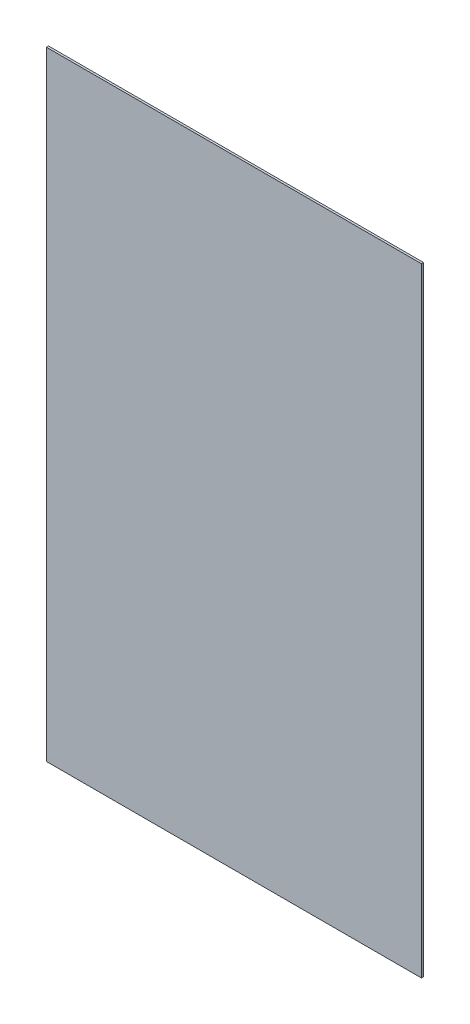
ISO-10303-21;
HEADER;
FILE_DESCRIPTION(('STEP AP214'),'2;1');
FILE_NAME('part.step','',(''),(''),'','','');
FILE_SCHEMA(('AUTOMOTIVE_DESIGN { 1 0 10303 214 1 1 1 1 }'));
ENDSEC;
DATA;
#1=APPLICATION_CONTEXT('core data for automotive mechanical design processes');
#2=APPLICATION_PROTOCOL_DEFINITION('international standard','automotive_design',2000,#1);
#3=PRODUCT_CONTEXT('',#1,'mechanical');
#4=PRODUCT('Part','Part','',(#3));
#5=PRODUCT_RELATED_PRODUCT_CATEGORY('part','',(#4));
#6=PRODUCT_DEFINITION_FORMATION('','',#4);
#7=PRODUCT_DEFINITION_CONTEXT('part definition',#1,'design');
#8=PRODUCT_DEFINITION('design','',#6,#7);
#9=PRODUCT_DEFINITION_SHAPE('','',#8);
#10=(LENGTH_UNIT() NAMED_UNIT(*) SI_UNIT(.MILLI.,.METRE.));
#11=(NAMED_UNIT(*) PLANE_ANGLE_UNIT() SI_UNIT($,.RADIAN.));
#12=(NAMED_UNIT(*) SI_UNIT($,.STERADIAN.) SOLID_ANGLE_UNIT());
#13=UNCERTAINTY_MEASURE_WITH_UNIT(LENGTH_MEASURE(1.E-05),#10,'distance_accuracy_value','');
#14=(GEOMETRIC_REPRESENTATION_CONTEXT(3) GLOBAL_UNCERTAINTY_ASSIGNED_CONTEXT((#13)) GLOBAL_UNIT_ASSIGNED_CONTEXT((#10,
#11,#12)) REPRESENTATION_CONTEXT('',''));
#15=CARTESIAN_POINT('',(0.,0.,0.));
#16=DIRECTION('',(0.,0.,1.));
#17=DIRECTION('',(1.,0.,0.));
#18=AXIS2_PLACEMENT_3D('',#15,#16,#17);
#19=CARTESIAN_POINT('',(88.5,-146.,1.));
#20=DIRECTION('',(-1.,0.,0.));
#21=DIRECTION('',(0.,0.,1.));
#22=AXIS2_PLACEMENT_3D('',#19,#20,#21);
#23=PLANE('',#22);
#24=DIRECTION('',(0.,1.,0.));
#25=VECTOR('',#24,1.);
#26=CARTESIAN_POINT('',(88.5,-146.,0.));
#27=LINE('',#26,#25);
#28=CARTESIAN_POINT('',(88.5,-146.,0.));
#29=VERTEX_POINT('',#28);
#30=CARTESIAN_POINT('',(88.5,146.,0.));
#31=VERTEX_POINT('',#30);
#32=EDGE_CURVE('E96',#29,#31,#27,.T.);
#33=ORIENTED_EDGE('',*,*,#32,.T.);
#34=DIRECTION('',(0.,0.,-1.));
#35=VECTOR('',#34,1.);
#36=CARTESIAN_POINT('',(88.5,146.,1.));
#37=LINE('',#36,#35);
#38=CARTESIAN_POINT('',(88.5,146.,1.));
#39=VERTEX_POINT('',#38);
#40=EDGE_CURVE('E11',#39,#31,#37,.T.);
#41=ORIENTED_EDGE('',*,*,#40,.F.);
#42=DIRECTION('',(0.,1.,0.));
#43=VECTOR('',#42,1.);
#44=CARTESIAN_POINT('',(88.5,-146.,1.));
#45=LINE('',#44,#43);
#46=CARTESIAN_POINT('',(88.5,-146.,1.));
#47=VERTEX_POINT('',#46);
#48=EDGE_CURVE('E84',#47,#39,#45,.T.);
#49=ORIENTED_EDGE('',*,*,#48,.F.);
#50=DIRECTION('',(0.,0.,-1.));
#51=VECTOR('',#50,1.);
#52=CARTESIAN_POINT('',(88.5,-146.,1.));
#53=LINE('',#52,#51);
#54=EDGE_CURVE('E92',#47,#29,#53,.T.);
#55=ORIENTED_EDGE('',*,*,#54,.T.);
#56=EDGE_LOOP('',(#33,#41,#49,#55));
#57=FACE_BOUND('',#56,.T.);
#58=ADVANCED_FACE('F33',(#57),#23,.F.);
#59=CARTESIAN_POINT('',(-88.5,146.,1.));
#60=DIRECTION('',(0.,-1.,0.));
#61=DIRECTION('',(0.,0.,-1.));
#62=AXIS2_PLACEMENT_3D('',#59,#60,#61);
#63=PLANE('',#62);
#64=DIRECTION('',(-1.,0.,0.));
#65=VECTOR('',#64,1.);
#66=CARTESIAN_POINT('',(-88.5,146.,0.));
#67=LINE('',#66,#65);
#68=CARTESIAN_POINT('',(-88.5,146.,0.));
#69=VERTEX_POINT('',#68);
#70=EDGE_CURVE('E88',#31,#69,#67,.T.);
#71=ORIENTED_EDGE('',*,*,#70,.T.);
#72=DIRECTION('',(0.,0.,-1.));
#73=VECTOR('',#72,1.);
#74=CARTESIAN_POINT('',(-88.5,146.,1.));
#75=LINE('',#74,#73);
#76=CARTESIAN_POINT('',(-88.5,146.,1.));
#77=VERTEX_POINT('',#76);
#78=EDGE_CURVE('E41',#77,#69,#75,.T.);
#79=ORIENTED_EDGE('',*,*,#78,.F.);
#80=DIRECTION('',(-1.,0.,0.));
#81=VECTOR('',#80,1.);
#82=CARTESIAN_POINT('',(-88.5,146.,1.));
#83=LINE('',#82,#81);
#84=EDGE_CURVE('E79',#39,#77,#83,.T.);
#85=ORIENTED_EDGE('',*,*,#84,.F.);
#86=ORIENTED_EDGE('',*,*,#40,.T.);
#87=EDGE_LOOP('',(#71,#79,#85,#86));
#88=FACE_BOUND('',#87,.T.);
#89=ADVANCED_FACE('F87',(#88),#63,.F.);
#90=CARTESIAN_POINT('',(-88.5,-146.,1.));
#91=DIRECTION('',(1.,0.,0.));
#92=DIRECTION('',(0.,0.,-1.));
#93=AXIS2_PLACEMENT_3D('',#90,#91,#92);
#94=PLANE('',#93);
#95=DIRECTION('',(0.,-1.,0.));
#96=VECTOR('',#95,1.);
#97=CARTESIAN_POINT('',(-88.5,-146.,0.));
#98=LINE('',#97,#96);
#99=CARTESIAN_POINT('',(-88.5,-146.,0.));
#100=VERTEX_POINT('',#99);
#101=EDGE_CURVE('E66',#69,#100,#98,.T.);
#102=ORIENTED_EDGE('',*,*,#101,.T.);
#103=DIRECTION('',(0.,0.,-1.));
#104=VECTOR('',#103,1.);
#105=CARTESIAN_POINT('',(-88.5,-146.,1.));
#106=LINE('',#105,#104);
#107=CARTESIAN_POINT('',(-88.5,-146.,1.));
#108=VERTEX_POINT('',#107);
#109=EDGE_CURVE('E89',#108,#100,#106,.T.);
#110=ORIENTED_EDGE('',*,*,#109,.F.);
#111=DIRECTION('',(0.,-1.,0.));
#112=VECTOR('',#111,1.);
#113=CARTESIAN_POINT('',(-88.5,-146.,1.));
#114=LINE('',#113,#112);
#115=EDGE_CURVE('E82',#77,#108,#114,.T.);
#116=ORIENTED_EDGE('',*,*,#115,.F.);
#117=ORIENTED_EDGE('',*,*,#78,.T.);
#118=EDGE_LOOP('',(#102,#110,#116,#117));
#119=FACE_BOUND('',#118,.T.);
#120=ADVANCED_FACE('F90',(#119),#94,.F.);
#121=CARTESIAN_POINT('',(-88.5,-146.,1.));
#122=DIRECTION('',(0.,1.,0.));
#123=DIRECTION('',(0.,0.,1.));
#124=AXIS2_PLACEMENT_3D('',#121,#122,#123);
#125=PLANE('',#124);
#126=DIRECTION('',(1.,0.,0.));
#127=VECTOR('',#126,1.);
#128=CARTESIAN_POINT('',(-88.5,-146.,0.));
#129=LINE('',#128,#127);
#130=EDGE_CURVE('E72',#100,#29,#129,.T.);
#131=ORIENTED_EDGE('',*,*,#130,.T.);
#132=ORIENTED_EDGE('',*,*,#54,.F.);
#133=DIRECTION('',(1.,0.,0.));
#134=VECTOR('',#133,1.);
#135=CARTESIAN_POINT('',(-88.5,-146.,1.));
#136=LINE('',#135,#134);
#137=EDGE_CURVE('E49',#108,#47,#136,.T.);
#138=ORIENTED_EDGE('',*,*,#137,.F.);
#139=ORIENTED_EDGE('',*,*,#109,.T.);
#140=EDGE_LOOP('',(#131,#132,#138,#139));
#141=FACE_BOUND('',#140,.T.);
#142=ADVANCED_FACE('F103',(#141),#125,.F.);
#143=CARTESIAN_POINT('',(88.5,146.,1.));
#144=DIRECTION('',(0.,0.,-1.));
#145=DIRECTION('',(-1.,0.,0.));
#146=AXIS2_PLACEMENT_3D('',#143,#144,#145);
#147=PLANE('',#146);
#148=ORIENTED_EDGE('',*,*,#48,.T.);
#149=ORIENTED_EDGE('',*,*,#84,.T.);
#150=ORIENTED_EDGE('',*,*,#115,.T.);
#151=ORIENTED_EDGE('',*,*,#137,.T.);
#152=EDGE_LOOP('',(#148,#149,#150,#151));
#153=FACE_BOUND('',#152,.T.);
#154=ADVANCED_FACE('F80',(#153),#147,.F.);
#155=CARTESIAN_POINT('',(88.5,146.,0.));
#156=DIRECTION('',(0.,0.,-1.));
#157=DIRECTION('',(-1.,0.,0.));
#158=AXIS2_PLACEMENT_3D('',#155,#156,#157);
#159=PLANE('',#158);
#160=ORIENTED_EDGE('',*,*,#32,.F.);
#161=ORIENTED_EDGE('',*,*,#130,.F.);
#162=ORIENTED_EDGE('',*,*,#101,.F.);
#163=ORIENTED_EDGE('',*,*,#70,.F.);
#164=EDGE_LOOP('',(#160,#161,#162,#163));
#165=FACE_BOUND('',#164,.T.);
#166=ADVANCED_FACE('F106',(#165),#159,.T.);
#167=CLOSED_SHELL('',(#58,#89,#120,#142,#154,#166));
#168=MANIFOLD_SOLID_BREP('B2',#167);
#169=ADVANCED_BREP_SHAPE_REPRESENTATION('',(#18,#168),#14);
#170=SHAPE_DEFINITION_REPRESENTATION(#9,#169);
ENDSEC;
END-ISO-10303-21;
